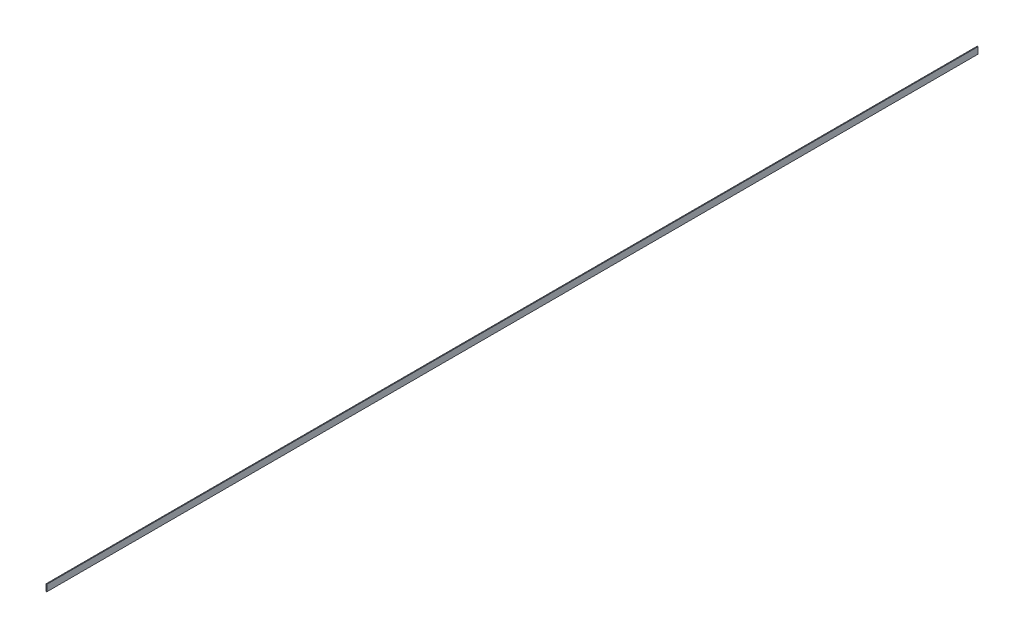
ISO-10303-21;
HEADER;
FILE_DESCRIPTION(('STEP AP214'),'2;1');
FILE_NAME('part.step','',(''),(''),'','','');
FILE_SCHEMA(('AUTOMOTIVE_DESIGN { 1 0 10303 214 1 1 1 1 }'));
ENDSEC;
DATA;
#1=APPLICATION_CONTEXT('core data for automotive mechanical design processes');
#2=APPLICATION_PROTOCOL_DEFINITION('international standard','automotive_design',2000,#1);
#3=PRODUCT_CONTEXT('',#1,'mechanical');
#4=PRODUCT('Part','Part','',(#3));
#5=PRODUCT_RELATED_PRODUCT_CATEGORY('part','',(#4));
#6=PRODUCT_DEFINITION_FORMATION('','',#4);
#7=PRODUCT_DEFINITION_CONTEXT('part definition',#1,'design');
#8=PRODUCT_DEFINITION('design','',#6,#7);
#9=PRODUCT_DEFINITION_SHAPE('','',#8);
#10=(LENGTH_UNIT() NAMED_UNIT(*) SI_UNIT(.MILLI.,.METRE.));
#11=(NAMED_UNIT(*) PLANE_ANGLE_UNIT() SI_UNIT($,.RADIAN.));
#12=(NAMED_UNIT(*) SI_UNIT($,.STERADIAN.) SOLID_ANGLE_UNIT());
#13=UNCERTAINTY_MEASURE_WITH_UNIT(LENGTH_MEASURE(1.E-05),#10,'distance_accuracy_value','');
#14=(GEOMETRIC_REPRESENTATION_CONTEXT(3) GLOBAL_UNCERTAINTY_ASSIGNED_CONTEXT((#13)) GLOBAL_UNIT_ASSIGNED_CONTEXT((#10,
#11,#12)) REPRESENTATION_CONTEXT('',''));
#15=CARTESIAN_POINT('',(0.,0.,0.));
#16=DIRECTION('',(0.,0.,1.));
#17=DIRECTION('',(1.,0.,0.));
#18=AXIS2_PLACEMENT_3D('',#15,#16,#17);
#19=CARTESIAN_POINT('',(0.,0.,-538.));
#20=DIRECTION('',(0.,1.,0.));
#21=DIRECTION('',(0.,0.,1.));
#22=AXIS2_PLACEMENT_3D('',#19,#20,#21);
#23=PLANE('',#22);
#24=DIRECTION('',(0.,0.,-1.));
#25=VECTOR('',#24,1.);
#26=CARTESIAN_POINT('',(-1.,0.,0.));
#27=LINE('',#26,#25);
#28=CARTESIAN_POINT('',(-0.999999999956536,0.,-861.948343958991));
#29=VERTEX_POINT('',#28);
#30=CARTESIAN_POINT('',(-1.00000000003514,0.,273.14834395899));
#31=VERTEX_POINT('',#30);
#32=EDGE_CURVE('E12',#29,#31,#27,.F.);
#33=ORIENTED_EDGE('',*,*,#32,.F.);
#34=DIRECTION('',(-1.,0.,-1.48936418753465E-13));
#35=VECTOR('',#34,1.);
#36=CARTESIAN_POINT('',(4.34097202628436E-11,0.,-861.948343958991));
#37=LINE('',#36,#35);
#38=CARTESIAN_POINT('',(4.34097202628436E-11,0.,-861.948343958991));
#39=VERTEX_POINT('',#38);
#40=EDGE_CURVE('E124',#39,#29,#37,.T.);
#41=ORIENTED_EDGE('',*,*,#40,.F.);
#42=DIRECTION('',(0.,0.,1.));
#43=VECTOR('',#42,1.);
#44=CARTESIAN_POINT('',(0.,0.,-538.));
#45=LINE('',#44,#43);
#46=CARTESIAN_POINT('',(-3.50448836616835E-11,0.,273.14834395899));
#47=VERTEX_POINT('',#46);
#48=EDGE_CURVE('E67',#39,#47,#45,.T.);
#49=ORIENTED_EDGE('',*,*,#48,.T.);
#50=DIRECTION('',(-1.,0.,-1.06137321154165E-13));
#51=VECTOR('',#50,1.);
#52=CARTESIAN_POINT('',(-3.50448836616835E-11,0.,273.14834395899));
#53=LINE('',#52,#51);
#54=EDGE_CURVE('E129',#47,#31,#53,.T.);
#55=ORIENTED_EDGE('',*,*,#54,.T.);
#56=EDGE_LOOP('',(#33,#41,#49,#55));
#57=FACE_BOUND('',#56,.T.);
#58=ADVANCED_FACE('F63',(#57),#23,.F.);
#59=CARTESIAN_POINT('',(0.,8.,-538.));
#60=DIRECTION('',(0.,1.,0.));
#61=DIRECTION('',(0.,0.,1.));
#62=AXIS2_PLACEMENT_3D('',#59,#60,#61);
#63=PLANE('',#62);
#64=DIRECTION('',(0.,0.,-1.));
#65=VECTOR('',#64,1.);
#66=CARTESIAN_POINT('',(-1.,8.,0.));
#67=LINE('',#66,#65);
#68=CARTESIAN_POINT('',(-0.999999999956536,8.,-861.948343958991));
#69=VERTEX_POINT('',#68);
#70=CARTESIAN_POINT('',(-1.00000000003514,8.,273.14834395899));
#71=VERTEX_POINT('',#70);
#72=EDGE_CURVE('E73',#69,#71,#67,.F.);
#73=ORIENTED_EDGE('',*,*,#72,.T.);
#74=DIRECTION('',(-1.,0.,-1.06137321154165E-13));
#75=VECTOR('',#74,1.);
#76=CARTESIAN_POINT('',(-3.50448836616835E-11,8.,273.14834395899));
#77=LINE('',#76,#75);
#78=CARTESIAN_POINT('',(-3.50448836616835E-11,8.,273.14834395899));
#79=VERTEX_POINT('',#78);
#80=EDGE_CURVE('E114',#79,#71,#77,.T.);
#81=ORIENTED_EDGE('',*,*,#80,.F.);
#82=DIRECTION('',(0.,0.,1.));
#83=VECTOR('',#82,1.);
#84=CARTESIAN_POINT('',(0.,8.,-538.));
#85=LINE('',#84,#83);
#86=CARTESIAN_POINT('',(4.34097202628436E-11,8.,-861.948343958991));
#87=VERTEX_POINT('',#86);
#88=EDGE_CURVE('E82',#87,#79,#85,.T.);
#89=ORIENTED_EDGE('',*,*,#88,.F.);
#90=DIRECTION('',(-1.,0.,-1.48936418753465E-13));
#91=VECTOR('',#90,1.);
#92=CARTESIAN_POINT('',(4.34097202628436E-11,8.,-861.948343958991));
#93=LINE('',#92,#91);
#94=EDGE_CURVE('E112',#87,#69,#93,.T.);
#95=ORIENTED_EDGE('',*,*,#94,.T.);
#96=EDGE_LOOP('',(#73,#81,#89,#95));
#97=FACE_BOUND('',#96,.T.);
#98=ADVANCED_FACE('F111',(#97),#63,.T.);
#99=CARTESIAN_POINT('',(-1.,0.,0.));
#100=DIRECTION('',(1.,0.,0.));
#101=DIRECTION('',(0.,0.,-1.));
#102=AXIS2_PLACEMENT_3D('',#99,#100,#101);
#103=PLANE('',#102);
#104=ORIENTED_EDGE('',*,*,#32,.T.);
#105=DIRECTION('',(0.,1.,0.));
#106=VECTOR('',#105,1.);
#107=CARTESIAN_POINT('',(-1.00000000003514,0.,273.14834395899));
#108=LINE('',#107,#106);
#109=EDGE_CURVE('E131',#71,#31,#108,.F.);
#110=ORIENTED_EDGE('',*,*,#109,.F.);
#111=ORIENTED_EDGE('',*,*,#72,.F.);
#112=DIRECTION('',(0.,1.,0.));
#113=VECTOR('',#112,1.);
#114=CARTESIAN_POINT('',(-0.999999999956536,0.,-861.948343958991));
#115=LINE('',#114,#113);
#116=EDGE_CURVE('E121',#29,#69,#115,.T.);
#117=ORIENTED_EDGE('',*,*,#116,.F.);
#118=EDGE_LOOP('',(#104,#110,#111,#117));
#119=FACE_BOUND('',#118,.T.);
#120=ADVANCED_FACE('F137',(#119),#103,.F.);
#121=CARTESIAN_POINT('',(0.,0.,0.));
#122=DIRECTION('',(1.,0.,0.));
#123=DIRECTION('',(0.,0.,-1.));
#124=AXIS2_PLACEMENT_3D('',#121,#122,#123);
#125=PLANE('',#124);
#126=ORIENTED_EDGE('',*,*,#48,.F.);
#127=DIRECTION('',(0.,1.,0.));
#128=VECTOR('',#127,1.);
#129=CARTESIAN_POINT('',(4.34097202628436E-11,0.,-861.948343958991));
#130=LINE('',#129,#128);
#131=EDGE_CURVE('E120',#39,#87,#130,.T.);
#132=ORIENTED_EDGE('',*,*,#131,.T.);
#133=ORIENTED_EDGE('',*,*,#88,.T.);
#134=DIRECTION('',(0.,-1.,0.));
#135=VECTOR('',#134,1.);
#136=CARTESIAN_POINT('',(-3.50448836616835E-11,8.,273.14834395899));
#137=LINE('',#136,#135);
#138=EDGE_CURVE('E116',#79,#47,#137,.T.);
#139=ORIENTED_EDGE('',*,*,#138,.T.);
#140=EDGE_LOOP('',(#126,#132,#133,#139));
#141=FACE_BOUND('',#140,.T.);
#142=ADVANCED_FACE('F65',(#141),#125,.T.);
#143=CARTESIAN_POINT('',(-3.50448836616835E-11,8.,273.14834395899));
#144=DIRECTION('',(-1.06137321154165E-13,0.,1.));
#145=DIRECTION('',(0.,-1.,0.));
#146=AXIS2_PLACEMENT_3D('',#143,#144,#145);
#147=PLANE('',#146);
#148=ORIENTED_EDGE('',*,*,#54,.F.);
#149=ORIENTED_EDGE('',*,*,#138,.F.);
#150=ORIENTED_EDGE('',*,*,#80,.T.);
#151=ORIENTED_EDGE('',*,*,#109,.T.);
#152=EDGE_LOOP('',(#148,#149,#150,#151));
#153=FACE_BOUND('',#152,.T.);
#154=ADVANCED_FACE('F136',(#153),#147,.T.);
#155=CARTESIAN_POINT('',(4.34097202628436E-11,0.,-861.948343958991));
#156=DIRECTION('',(1.48936418753465E-13,0.,-1.));
#157=DIRECTION('',(0.,1.,0.));
#158=AXIS2_PLACEMENT_3D('',#155,#156,#157);
#159=PLANE('',#158);
#160=ORIENTED_EDGE('',*,*,#94,.F.);
#161=ORIENTED_EDGE('',*,*,#131,.F.);
#162=ORIENTED_EDGE('',*,*,#40,.T.);
#163=ORIENTED_EDGE('',*,*,#116,.T.);
#164=EDGE_LOOP('',(#160,#161,#162,#163));
#165=FACE_BOUND('',#164,.T.);
#166=ADVANCED_FACE('F119',(#165),#159,.T.);
#167=CLOSED_SHELL('',(#58,#98,#120,#142,#154,#166));
#168=MANIFOLD_SOLID_BREP('B2',#167);
#169=ADVANCED_BREP_SHAPE_REPRESENTATION('',(#18,#168),#14);
#170=SHAPE_DEFINITION_REPRESENTATION(#9,#169);
ENDSEC;
END-ISO-10303-21;
